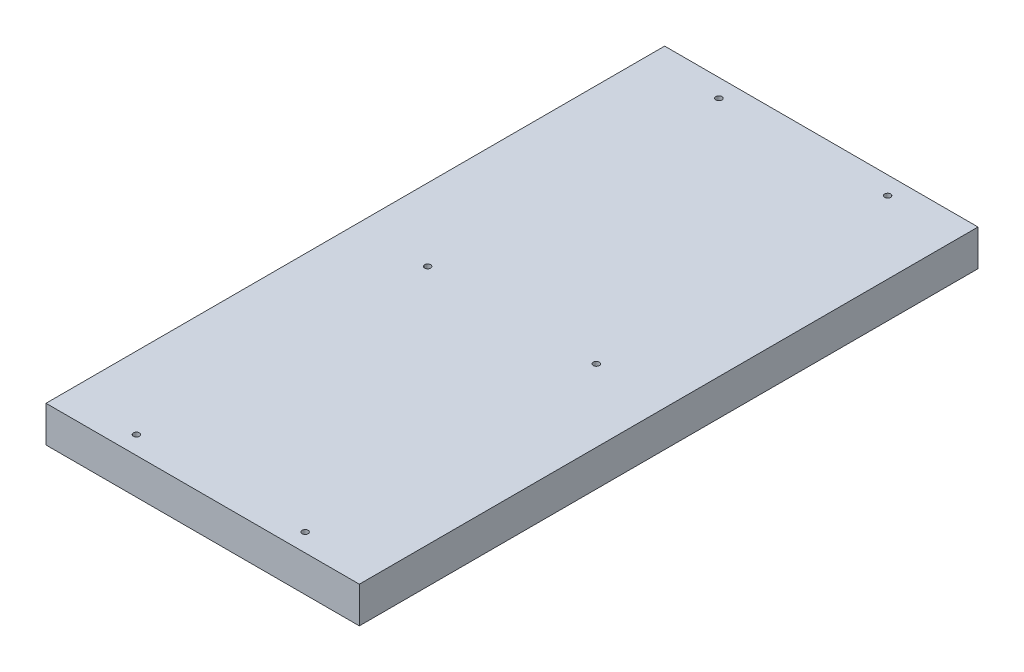
ISO-10303-21;
HEADER;
FILE_DESCRIPTION(('STEP AP214'),'2;1');
FILE_NAME('part.step','',(''),(''),'','','');
FILE_SCHEMA(('AUTOMOTIVE_DESIGN { 1 0 10303 214 1 1 1 1 }'));
ENDSEC;
DATA;
#1=APPLICATION_CONTEXT('core data for automotive mechanical design processes');
#2=APPLICATION_PROTOCOL_DEFINITION('international standard','automotive_design',2000,#1);
#3=PRODUCT_CONTEXT('',#1,'mechanical');
#4=PRODUCT('Part','Part','',(#3));
#5=PRODUCT_RELATED_PRODUCT_CATEGORY('part','',(#4));
#6=PRODUCT_DEFINITION_FORMATION('','',#4);
#7=PRODUCT_DEFINITION_CONTEXT('part definition',#1,'design');
#8=PRODUCT_DEFINITION('design','',#6,#7);
#9=PRODUCT_DEFINITION_SHAPE('','',#8);
#10=(LENGTH_UNIT() NAMED_UNIT(*) SI_UNIT(.MILLI.,.METRE.));
#11=(NAMED_UNIT(*) PLANE_ANGLE_UNIT() SI_UNIT($,.RADIAN.));
#12=(NAMED_UNIT(*) SI_UNIT($,.STERADIAN.) SOLID_ANGLE_UNIT());
#13=UNCERTAINTY_MEASURE_WITH_UNIT(LENGTH_MEASURE(1.E-05),#10,'distance_accuracy_value','');
#14=(GEOMETRIC_REPRESENTATION_CONTEXT(3) GLOBAL_UNCERTAINTY_ASSIGNED_CONTEXT((#13)) GLOBAL_UNIT_ASSIGNED_CONTEXT((#10,
#11,#12)) REPRESENTATION_CONTEXT('',''));
#15=CARTESIAN_POINT('',(0.,0.,0.));
#16=DIRECTION('',(0.,0.,1.));
#17=DIRECTION('',(1.,0.,0.));
#18=AXIS2_PLACEMENT_3D('',#15,#16,#17);
#19=CARTESIAN_POINT('',(195.,-22.5,770.));
#20=DIRECTION('',(-1.,0.,0.));
#21=DIRECTION('',(0.,0.,1.));
#22=AXIS2_PLACEMENT_3D('',#19,#20,#21);
#23=PLANE('',#22);
#24=DIRECTION('',(0.,1.,0.));
#25=VECTOR('',#24,1.);
#26=CARTESIAN_POINT('',(195.,-22.5,0.));
#27=LINE('',#26,#25);
#28=CARTESIAN_POINT('',(195.,-22.5,0.));
#29=VERTEX_POINT('',#28);
#30=CARTESIAN_POINT('',(195.,22.5,0.));
#31=VERTEX_POINT('',#30);
#32=EDGE_CURVE('E105',#29,#31,#27,.T.);
#33=ORIENTED_EDGE('',*,*,#32,.T.);
#34=DIRECTION('',(0.,0.,-1.));
#35=VECTOR('',#34,1.);
#36=CARTESIAN_POINT('',(195.,22.5,770.));
#37=LINE('',#36,#35);
#38=CARTESIAN_POINT('',(195.,22.5,770.));
#39=VERTEX_POINT('',#38);
#40=EDGE_CURVE('E11',#39,#31,#37,.T.);
#41=ORIENTED_EDGE('',*,*,#40,.F.);
#42=DIRECTION('',(0.,1.,0.));
#43=VECTOR('',#42,1.);
#44=CARTESIAN_POINT('',(195.,-22.5,770.));
#45=LINE('',#44,#43);
#46=CARTESIAN_POINT('',(195.,-22.5,770.));
#47=VERTEX_POINT('',#46);
#48=EDGE_CURVE('E89',#47,#39,#45,.T.);
#49=ORIENTED_EDGE('',*,*,#48,.F.);
#50=DIRECTION('',(0.,0.,-1.));
#51=VECTOR('',#50,1.);
#52=CARTESIAN_POINT('',(195.,-22.5,770.));
#53=LINE('',#52,#51);
#54=EDGE_CURVE('E98',#47,#29,#53,.T.);
#55=ORIENTED_EDGE('',*,*,#54,.T.);
#56=EDGE_LOOP('',(#33,#41,#49,#55));
#57=FACE_BOUND('',#56,.T.);
#58=ADVANCED_FACE('F39',(#57),#23,.F.);
#59=CARTESIAN_POINT('',(-195.,22.5,770.));
#60=DIRECTION('',(0.,-1.,0.));
#61=DIRECTION('',(0.,0.,-1.));
#62=AXIS2_PLACEMENT_3D('',#59,#60,#61);
#63=PLANE('',#62);
#64=CARTESIAN_POINT('',(105.,22.5,22.5));
#65=DIRECTION('',(0.,1.,0.));
#66=DIRECTION('',(0.,0.,-1.));
#67=AXIS2_PLACEMENT_3D('',#64,#65,#66);
#68=CIRCLE('',#67,3.75000000000001);
#69=CARTESIAN_POINT('',(105.,22.5,18.75));
#70=VERTEX_POINT('',#69);
#71=EDGE_CURVE('E118',#70,#70,#68,.T.);
#72=ORIENTED_EDGE('',*,*,#71,.F.);
#73=EDGE_LOOP('',(#72));
#74=FACE_BOUND('',#73,.T.);
#75=CARTESIAN_POINT('',(105.,22.5,747.5));
#76=DIRECTION('',(0.,1.,0.));
#77=DIRECTION('',(0.,0.,1.));
#78=AXIS2_PLACEMENT_3D('',#75,#76,#77);
#79=CIRCLE('',#78,3.75000000000002);
#80=CARTESIAN_POINT('',(105.,22.5,751.25));
#81=VERTEX_POINT('',#80);
#82=EDGE_CURVE('E132',#81,#81,#79,.T.);
#83=ORIENTED_EDGE('',*,*,#82,.F.);
#84=EDGE_LOOP('',(#83));
#85=FACE_BOUND('',#84,.T.);
#86=CARTESIAN_POINT('',(-105.,22.5,747.5));
#87=DIRECTION('',(0.,1.,0.));
#88=DIRECTION('',(0.,0.,-1.));
#89=AXIS2_PLACEMENT_3D('',#86,#87,#88);
#90=CIRCLE('',#89,3.75000000000002);
#91=CARTESIAN_POINT('',(-105.,22.5,743.75));
#92=VERTEX_POINT('',#91);
#93=EDGE_CURVE('E129',#92,#92,#90,.T.);
#94=ORIENTED_EDGE('',*,*,#93,.F.);
#95=EDGE_LOOP('',(#94));
#96=FACE_BOUND('',#95,.T.);
#97=CARTESIAN_POINT('',(-105.,22.5,385.));
#98=DIRECTION('',(0.,1.,0.));
#99=DIRECTION('',(0.,0.,1.));
#100=AXIS2_PLACEMENT_3D('',#97,#98,#99);
#101=CIRCLE('',#100,3.75000000000001);
#102=CARTESIAN_POINT('',(-105.,22.5,388.75));
#103=VERTEX_POINT('',#102);
#104=EDGE_CURVE('E125',#103,#103,#101,.T.);
#105=ORIENTED_EDGE('',*,*,#104,.F.);
#106=EDGE_LOOP('',(#105));
#107=FACE_BOUND('',#106,.T.);
#108=CARTESIAN_POINT('',(105.,22.5,385.));
#109=DIRECTION('',(0.,1.,0.));
#110=DIRECTION('',(0.,0.,1.));
#111=AXIS2_PLACEMENT_3D('',#108,#109,#110);
#112=CIRCLE('',#111,3.75000000000001);
#113=CARTESIAN_POINT('',(105.,22.5,388.75));
#114=VERTEX_POINT('',#113);
#115=EDGE_CURVE('E127',#114,#114,#112,.T.);
#116=ORIENTED_EDGE('',*,*,#115,.F.);
#117=EDGE_LOOP('',(#116));
#118=FACE_BOUND('',#117,.T.);
#119=CARTESIAN_POINT('',(-105.,22.5,22.5));
#120=DIRECTION('',(0.,1.,0.));
#121=DIRECTION('',(0.,0.,1.));
#122=AXIS2_PLACEMENT_3D('',#119,#120,#121);
#123=CIRCLE('',#122,3.75000000000001);
#124=CARTESIAN_POINT('',(-105.,22.5,26.25));
#125=VERTEX_POINT('',#124);
#126=EDGE_CURVE('E119',#125,#125,#123,.T.);
#127=ORIENTED_EDGE('',*,*,#126,.F.);
#128=EDGE_LOOP('',(#127));
#129=FACE_BOUND('',#128,.T.);
#130=DIRECTION('',(-1.,0.,0.));
#131=VECTOR('',#130,1.);
#132=CARTESIAN_POINT('',(-195.,22.5,0.));
#133=LINE('',#132,#131);
#134=CARTESIAN_POINT('',(-195.,22.5,0.));
#135=VERTEX_POINT('',#134);
#136=EDGE_CURVE('E94',#31,#135,#133,.T.);
#137=ORIENTED_EDGE('',*,*,#136,.T.);
#138=DIRECTION('',(0.,0.,-1.));
#139=VECTOR('',#138,1.);
#140=CARTESIAN_POINT('',(-195.,22.5,770.));
#141=LINE('',#140,#139);
#142=CARTESIAN_POINT('',(-195.,22.5,770.));
#143=VERTEX_POINT('',#142);
#144=EDGE_CURVE('E50',#143,#135,#141,.T.);
#145=ORIENTED_EDGE('',*,*,#144,.F.);
#146=DIRECTION('',(-1.,0.,0.));
#147=VECTOR('',#146,1.);
#148=CARTESIAN_POINT('',(-195.,22.5,770.));
#149=LINE('',#148,#147);
#150=EDGE_CURVE('E84',#39,#143,#149,.T.);
#151=ORIENTED_EDGE('',*,*,#150,.F.);
#152=ORIENTED_EDGE('',*,*,#40,.T.);
#153=EDGE_LOOP('',(#137,#145,#151,#152));
#154=FACE_BOUND('',#153,.T.);
#155=ADVANCED_FACE('F91',(#74,#85,#96,#107,#118,#129,#154),#63,.F.);
#156=CARTESIAN_POINT('',(-195.,-22.5,770.));
#157=DIRECTION('',(1.,0.,0.));
#158=DIRECTION('',(0.,0.,-1.));
#159=AXIS2_PLACEMENT_3D('',#156,#157,#158);
#160=PLANE('',#159);
#161=DIRECTION('',(0.,-1.,0.));
#162=VECTOR('',#161,1.);
#163=CARTESIAN_POINT('',(-195.,-22.5,0.));
#164=LINE('',#163,#162);
#165=CARTESIAN_POINT('',(-195.,-22.5,0.));
#166=VERTEX_POINT('',#165);
#167=EDGE_CURVE('E75',#135,#166,#164,.T.);
#168=ORIENTED_EDGE('',*,*,#167,.T.);
#169=DIRECTION('',(0.,0.,-1.));
#170=VECTOR('',#169,1.);
#171=CARTESIAN_POINT('',(-195.,-22.5,770.));
#172=LINE('',#171,#170);
#173=CARTESIAN_POINT('',(-195.,-22.5,770.));
#174=VERTEX_POINT('',#173);
#175=EDGE_CURVE('E92',#174,#166,#172,.T.);
#176=ORIENTED_EDGE('',*,*,#175,.F.);
#177=DIRECTION('',(0.,-1.,0.));
#178=VECTOR('',#177,1.);
#179=CARTESIAN_POINT('',(-195.,-22.5,770.));
#180=LINE('',#179,#178);
#181=EDGE_CURVE('E86',#143,#174,#180,.T.);
#182=ORIENTED_EDGE('',*,*,#181,.F.);
#183=ORIENTED_EDGE('',*,*,#144,.T.);
#184=EDGE_LOOP('',(#168,#176,#182,#183));
#185=FACE_BOUND('',#184,.T.);
#186=ADVANCED_FACE('F96',(#185),#160,.F.);
#187=CARTESIAN_POINT('',(-195.,-22.5,770.));
#188=DIRECTION('',(0.,1.,0.));
#189=DIRECTION('',(0.,0.,1.));
#190=AXIS2_PLACEMENT_3D('',#187,#188,#189);
#191=PLANE('',#190);
#192=DIRECTION('',(1.,0.,0.));
#193=VECTOR('',#192,1.);
#194=CARTESIAN_POINT('',(-195.,-22.5,0.));
#195=LINE('',#194,#193);
#196=EDGE_CURVE('E80',#166,#29,#195,.T.);
#197=ORIENTED_EDGE('',*,*,#196,.T.);
#198=ORIENTED_EDGE('',*,*,#54,.F.);
#199=DIRECTION('',(1.,0.,0.));
#200=VECTOR('',#199,1.);
#201=CARTESIAN_POINT('',(-195.,-22.5,770.));
#202=LINE('',#201,#200);
#203=EDGE_CURVE('E54',#174,#47,#202,.T.);
#204=ORIENTED_EDGE('',*,*,#203,.F.);
#205=ORIENTED_EDGE('',*,*,#175,.T.);
#206=EDGE_LOOP('',(#197,#198,#204,#205));
#207=FACE_BOUND('',#206,.T.);
#208=ADVANCED_FACE('F109',(#207),#191,.F.);
#209=CARTESIAN_POINT('',(0.,0.,770.));
#210=DIRECTION('',(0.,0.,-1.));
#211=DIRECTION('',(-1.,0.,0.));
#212=AXIS2_PLACEMENT_3D('',#209,#210,#211);
#213=PLANE('',#212);
#214=ORIENTED_EDGE('',*,*,#48,.T.);
#215=ORIENTED_EDGE('',*,*,#150,.T.);
#216=ORIENTED_EDGE('',*,*,#181,.T.);
#217=ORIENTED_EDGE('',*,*,#203,.T.);
#218=EDGE_LOOP('',(#214,#215,#216,#217));
#219=FACE_BOUND('',#218,.T.);
#220=ADVANCED_FACE('F88',(#219),#213,.F.);
#221=CARTESIAN_POINT('',(0.,0.,0.));
#222=DIRECTION('',(0.,0.,-1.));
#223=DIRECTION('',(-1.,0.,0.));
#224=AXIS2_PLACEMENT_3D('',#221,#222,#223);
#225=PLANE('',#224);
#226=ORIENTED_EDGE('',*,*,#32,.F.);
#227=ORIENTED_EDGE('',*,*,#196,.F.);
#228=ORIENTED_EDGE('',*,*,#167,.F.);
#229=ORIENTED_EDGE('',*,*,#136,.F.);
#230=EDGE_LOOP('',(#226,#227,#228,#229));
#231=FACE_BOUND('',#230,.T.);
#232=ADVANCED_FACE('F114',(#231),#225,.T.);
#233=CARTESIAN_POINT('',(-105.,2.5,22.5));
#234=DIRECTION('',(0.,1.,0.));
#235=DIRECTION('',(0.,0.,1.));
#236=AXIS2_PLACEMENT_3D('',#233,#234,#235);
#237=CYLINDRICAL_SURFACE('',#236,3.75000000000001);
#238=CARTESIAN_POINT('',(-105.,2.5,22.5));
#239=DIRECTION('',(0.,1.,0.));
#240=DIRECTION('',(0.,0.,1.));
#241=AXIS2_PLACEMENT_3D('',#238,#239,#240);
#242=CIRCLE('',#241,3.75000000000001);
#243=CARTESIAN_POINT('',(-105.,2.5,26.25));
#244=VERTEX_POINT('',#243);
#245=EDGE_CURVE('E104',#244,#244,#242,.T.);
#246=ORIENTED_EDGE('',*,*,#245,.F.);
#247=EDGE_LOOP('',(#246));
#248=FACE_BOUND('',#247,.T.);
#249=ORIENTED_EDGE('',*,*,#126,.T.);
#250=EDGE_LOOP('',(#249));
#251=FACE_BOUND('',#250,.T.);
#252=ADVANCED_FACE('F187',(#248,#251),#237,.F.);
#253=CARTESIAN_POINT('',(-105.,2.5,22.5));
#254=DIRECTION('',(0.,1.,0.));
#255=DIRECTION('',(0.,0.,1.));
#256=AXIS2_PLACEMENT_3D('',#253,#254,#255);
#257=PLANE('',#256);
#258=ORIENTED_EDGE('',*,*,#245,.T.);
#259=EDGE_LOOP('',(#258));
#260=FACE_BOUND('',#259,.T.);
#261=ADVANCED_FACE('F169',(#260),#257,.T.);
#262=CARTESIAN_POINT('',(105.,2.5,385.));
#263=DIRECTION('',(0.,1.,0.));
#264=DIRECTION('',(0.,0.,1.));
#265=AXIS2_PLACEMENT_3D('',#262,#263,#264);
#266=CYLINDRICAL_SURFACE('',#265,3.75000000000001);
#267=ORIENTED_EDGE('',*,*,#115,.T.);
#268=EDGE_LOOP('',(#267));
#269=FACE_BOUND('',#268,.T.);
#270=CARTESIAN_POINT('',(105.,-7.5,385.));
#271=DIRECTION('',(0.,1.,0.));
#272=DIRECTION('',(0.,0.,1.));
#273=AXIS2_PLACEMENT_3D('',#270,#271,#272);
#274=CIRCLE('',#273,3.75000000000003);
#275=CARTESIAN_POINT('',(105.,-7.5,388.75));
#276=VERTEX_POINT('',#275);
#277=EDGE_CURVE('E148',#276,#276,#274,.T.);
#278=ORIENTED_EDGE('',*,*,#277,.F.);
#279=EDGE_LOOP('',(#278));
#280=FACE_BOUND('',#279,.T.);
#281=ADVANCED_FACE('F160',(#269,#280),#266,.F.);
#282=CARTESIAN_POINT('',(-105.,2.5,385.));
#283=DIRECTION('',(0.,1.,0.));
#284=DIRECTION('',(0.,0.,1.));
#285=AXIS2_PLACEMENT_3D('',#282,#283,#284);
#286=CYLINDRICAL_SURFACE('',#285,3.75000000000001);
#287=ORIENTED_EDGE('',*,*,#104,.T.);
#288=EDGE_LOOP('',(#287));
#289=FACE_BOUND('',#288,.T.);
#290=CARTESIAN_POINT('',(-105.,-7.5,385.));
#291=DIRECTION('',(0.,1.,0.));
#292=DIRECTION('',(0.,0.,1.));
#293=AXIS2_PLACEMENT_3D('',#290,#291,#292);
#294=CIRCLE('',#293,3.75000000000003);
#295=CARTESIAN_POINT('',(-105.,-7.5,388.75));
#296=VERTEX_POINT('',#295);
#297=EDGE_CURVE('E144',#296,#296,#294,.T.);
#298=ORIENTED_EDGE('',*,*,#297,.F.);
#299=EDGE_LOOP('',(#298));
#300=FACE_BOUND('',#299,.T.);
#301=ADVANCED_FACE('F152',(#289,#300),#286,.F.);
#302=CARTESIAN_POINT('',(-105.,2.5,747.5));
#303=DIRECTION('',(0.,1.,0.));
#304=DIRECTION('',(0.,0.,1.));
#305=AXIS2_PLACEMENT_3D('',#302,#303,#304);
#306=CYLINDRICAL_SURFACE('',#305,3.75000000000002);
#307=CARTESIAN_POINT('',(-105.,2.5,747.5));
#308=DIRECTION('',(0.,1.,0.));
#309=DIRECTION('',(0.,0.,-1.));
#310=AXIS2_PLACEMENT_3D('',#307,#308,#309);
#311=CIRCLE('',#310,3.75000000000002);
#312=CARTESIAN_POINT('',(-105.,2.5,743.75));
#313=VERTEX_POINT('',#312);
#314=EDGE_CURVE('E124',#313,#313,#311,.T.);
#315=ORIENTED_EDGE('',*,*,#314,.F.);
#316=EDGE_LOOP('',(#315));
#317=FACE_BOUND('',#316,.T.);
#318=ORIENTED_EDGE('',*,*,#93,.T.);
#319=EDGE_LOOP('',(#318));
#320=FACE_BOUND('',#319,.T.);
#321=ADVANCED_FACE('F156',(#317,#320),#306,.F.);
#322=CARTESIAN_POINT('',(-105.,2.5,747.5));
#323=DIRECTION('',(0.,-1.,0.));
#324=DIRECTION('',(0.,0.,-1.));
#325=AXIS2_PLACEMENT_3D('',#322,#323,#324);
#326=PLANE('',#325);
#327=ORIENTED_EDGE('',*,*,#314,.T.);
#328=EDGE_LOOP('',(#327));
#329=FACE_BOUND('',#328,.T.);
#330=ADVANCED_FACE('F164',(#329),#326,.F.);
#331=CARTESIAN_POINT('',(105.,2.5,747.5));
#332=DIRECTION('',(0.,1.,0.));
#333=DIRECTION('',(0.,0.,1.));
#334=AXIS2_PLACEMENT_3D('',#331,#332,#333);
#335=CYLINDRICAL_SURFACE('',#334,3.75000000000002);
#336=CARTESIAN_POINT('',(105.,2.5,747.5));
#337=DIRECTION('',(0.,1.,0.));
#338=DIRECTION('',(0.,0.,1.));
#339=AXIS2_PLACEMENT_3D('',#336,#337,#338);
#340=CIRCLE('',#339,3.75000000000002);
#341=CARTESIAN_POINT('',(105.,2.5,751.25));
#342=VERTEX_POINT('',#341);
#343=EDGE_CURVE('E131',#342,#342,#340,.T.);
#344=ORIENTED_EDGE('',*,*,#343,.F.);
#345=EDGE_LOOP('',(#344));
#346=FACE_BOUND('',#345,.T.);
#347=ORIENTED_EDGE('',*,*,#82,.T.);
#348=EDGE_LOOP('',(#347));
#349=FACE_BOUND('',#348,.T.);
#350=ADVANCED_FACE('F217',(#346,#349),#335,.F.);
#351=CARTESIAN_POINT('',(105.,2.5,747.5));
#352=DIRECTION('',(0.,1.,0.));
#353=DIRECTION('',(0.,0.,1.));
#354=AXIS2_PLACEMENT_3D('',#351,#352,#353);
#355=PLANE('',#354);
#356=ORIENTED_EDGE('',*,*,#343,.T.);
#357=EDGE_LOOP('',(#356));
#358=FACE_BOUND('',#357,.T.);
#359=ADVANCED_FACE('F229',(#358),#355,.T.);
#360=CARTESIAN_POINT('',(105.,2.5,22.5));
#361=DIRECTION('',(0.,1.,0.));
#362=DIRECTION('',(0.,0.,1.));
#363=AXIS2_PLACEMENT_3D('',#360,#361,#362);
#364=CYLINDRICAL_SURFACE('',#363,3.75000000000001);
#365=CARTESIAN_POINT('',(105.,2.5,22.5));
#366=DIRECTION('',(0.,1.,0.));
#367=DIRECTION('',(0.,0.,-1.));
#368=AXIS2_PLACEMENT_3D('',#365,#366,#367);
#369=CIRCLE('',#368,3.75000000000001);
#370=CARTESIAN_POINT('',(105.,2.5,18.75));
#371=VERTEX_POINT('',#370);
#372=EDGE_CURVE('E136',#371,#371,#369,.T.);
#373=ORIENTED_EDGE('',*,*,#372,.F.);
#374=EDGE_LOOP('',(#373));
#375=FACE_BOUND('',#374,.T.);
#376=ORIENTED_EDGE('',*,*,#71,.T.);
#377=EDGE_LOOP('',(#376));
#378=FACE_BOUND('',#377,.T.);
#379=ADVANCED_FACE('F234',(#375,#378),#364,.F.);
#380=CARTESIAN_POINT('',(105.,2.5,22.5));
#381=DIRECTION('',(0.,-1.,0.));
#382=DIRECTION('',(0.,0.,-1.));
#383=AXIS2_PLACEMENT_3D('',#380,#381,#382);
#384=PLANE('',#383);
#385=ORIENTED_EDGE('',*,*,#372,.T.);
#386=EDGE_LOOP('',(#385));
#387=FACE_BOUND('',#386,.T.);
#388=ADVANCED_FACE('F243',(#387),#384,.F.);
#389=CARTESIAN_POINT('',(-105.,-7.5,385.));
#390=DIRECTION('',(0.,1.,0.));
#391=DIRECTION('',(0.,0.,1.));
#392=AXIS2_PLACEMENT_3D('',#389,#390,#391);
#393=PLANE('',#392);
#394=ORIENTED_EDGE('',*,*,#297,.T.);
#395=EDGE_LOOP('',(#394));
#396=FACE_BOUND('',#395,.T.);
#397=ADVANCED_FACE('F155',(#396),#393,.T.);
#398=CARTESIAN_POINT('',(105.,-7.5,385.));
#399=DIRECTION('',(0.,1.,0.));
#400=DIRECTION('',(0.,0.,1.));
#401=AXIS2_PLACEMENT_3D('',#398,#399,#400);
#402=PLANE('',#401);
#403=ORIENTED_EDGE('',*,*,#277,.T.);
#404=EDGE_LOOP('',(#403));
#405=FACE_BOUND('',#404,.T.);
#406=ADVANCED_FACE('F273',(#405),#402,.T.);
#407=CLOSED_SHELL('',(#58,#155,#186,#208,#220,#232,#252,#261,#281,#301,#321,#330,#350,#359,#379,
#388,#397,#406));
#408=MANIFOLD_SOLID_BREP('B2',#407);
#409=ADVANCED_BREP_SHAPE_REPRESENTATION('',(#18,#408),#14);
#410=SHAPE_DEFINITION_REPRESENTATION(#9,#409);
ENDSEC;
END-ISO-10303-21;
